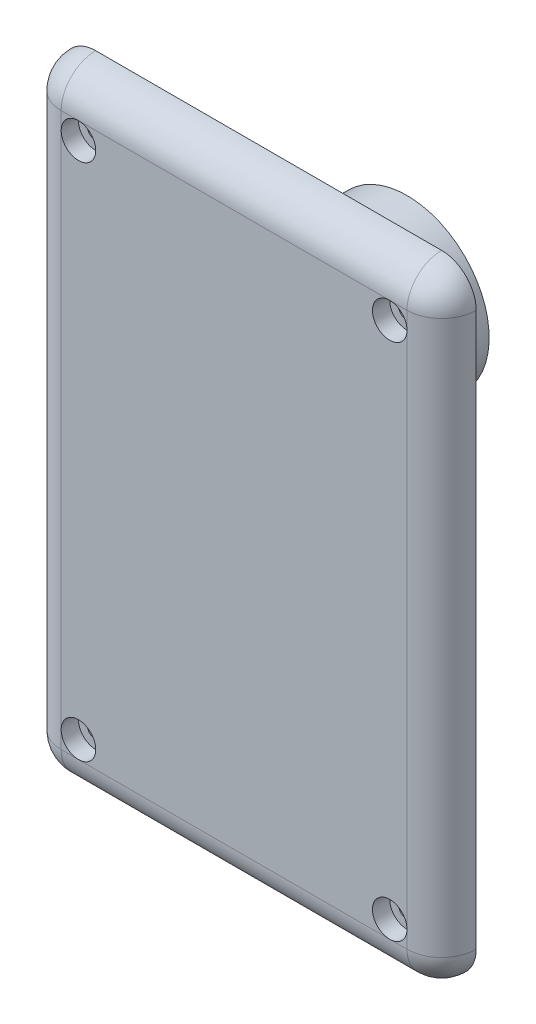
ISO-10303-21;
HEADER;
FILE_DESCRIPTION(('STEP AP214'),'2;1');
FILE_NAME('part.step','',(''),(''),'','','');
FILE_SCHEMA(('AUTOMOTIVE_DESIGN { 1 0 10303 214 1 1 1 1 }'));
ENDSEC;
DATA;
#1=APPLICATION_CONTEXT('core data for automotive mechanical design processes');
#2=APPLICATION_PROTOCOL_DEFINITION('international standard','automotive_design',2000,#1);
#3=PRODUCT_CONTEXT('',#1,'mechanical');
#4=PRODUCT('Part','Part','',(#3));
#5=PRODUCT_RELATED_PRODUCT_CATEGORY('part','',(#4));
#6=PRODUCT_DEFINITION_FORMATION('','',#4);
#7=PRODUCT_DEFINITION_CONTEXT('part definition',#1,'design');
#8=PRODUCT_DEFINITION('design','',#6,#7);
#9=PRODUCT_DEFINITION_SHAPE('','',#8);
#10=(LENGTH_UNIT() NAMED_UNIT(*) SI_UNIT(.MILLI.,.METRE.));
#11=(NAMED_UNIT(*) PLANE_ANGLE_UNIT() SI_UNIT($,.RADIAN.));
#12=(NAMED_UNIT(*) SI_UNIT($,.STERADIAN.) SOLID_ANGLE_UNIT());
#13=UNCERTAINTY_MEASURE_WITH_UNIT(LENGTH_MEASURE(1.E-05),#10,'distance_accuracy_value','');
#14=(GEOMETRIC_REPRESENTATION_CONTEXT(3) GLOBAL_UNCERTAINTY_ASSIGNED_CONTEXT((#13)) GLOBAL_UNIT_ASSIGNED_CONTEXT((#10,
#11,#12)) REPRESENTATION_CONTEXT('',''));
#15=CARTESIAN_POINT('',(0.,0.,0.));
#16=DIRECTION('',(0.,0.,1.));
#17=DIRECTION('',(1.,0.,0.));
#18=AXIS2_PLACEMENT_3D('',#15,#16,#17);
#19=CARTESIAN_POINT('',(0.,0.,0.));
#20=DIRECTION('',(0.,0.,-1.));
#21=DIRECTION('',(-1.,0.,0.));
#22=AXIS2_PLACEMENT_3D('',#19,#20,#21);
#23=PLANE('',#22);
#24=CARTESIAN_POINT('',(-118.790086771129,74.7285838497429,0.));
#25=DIRECTION('',(0.,0.,-1.));
#26=DIRECTION('',(-1.,0.,0.));
#27=AXIS2_PLACEMENT_3D('',#24,#25,#26);
#28=CIRCLE('',#27,0.499999999999999);
#29=CARTESIAN_POINT('',(-119.290086771129,74.7285838497429,0.));
#30=VERTEX_POINT('',#29);
#31=EDGE_CURVE('E186',#30,#30,#28,.F.);
#32=ORIENTED_EDGE('',*,*,#31,.T.);
#33=EDGE_LOOP('',(#32));
#34=FACE_BOUND('',#33,.T.);
#35=CARTESIAN_POINT('',(-100.790086771129,74.7285838497429,0.));
#36=DIRECTION('',(0.,0.,-1.));
#37=DIRECTION('',(-1.,0.,0.));
#38=AXIS2_PLACEMENT_3D('',#35,#36,#37);
#39=CIRCLE('',#38,0.499999999999999);
#40=CARTESIAN_POINT('',(-101.290086771129,74.7285838497429,0.));
#41=VERTEX_POINT('',#40);
#42=EDGE_CURVE('E218',#41,#41,#39,.F.);
#43=ORIENTED_EDGE('',*,*,#42,.T.);
#44=EDGE_LOOP('',(#43));
#45=FACE_BOUND('',#44,.T.);
#46=CARTESIAN_POINT('',(-100.790086771129,44.728583849743,0.));
#47=DIRECTION('',(0.,0.,-1.));
#48=DIRECTION('',(-1.,0.,0.));
#49=AXIS2_PLACEMENT_3D('',#46,#47,#48);
#50=CIRCLE('',#49,0.499999999999999);
#51=CARTESIAN_POINT('',(-101.290086771129,44.728583849743,0.));
#52=VERTEX_POINT('',#51);
#53=EDGE_CURVE('E210',#52,#52,#50,.F.);
#54=ORIENTED_EDGE('',*,*,#53,.T.);
#55=EDGE_LOOP('',(#54));
#56=FACE_BOUND('',#55,.T.);
#57=CARTESIAN_POINT('',(-118.790086771129,44.728583849743,0.));
#58=DIRECTION('',(0.,0.,-1.));
#59=DIRECTION('',(-1.,0.,0.));
#60=AXIS2_PLACEMENT_3D('',#57,#58,#59);
#61=CIRCLE('',#60,0.499999999999999);
#62=CARTESIAN_POINT('',(-119.290086771129,44.728583849743,0.));
#63=VERTEX_POINT('',#62);
#64=EDGE_CURVE('E209',#63,#63,#61,.F.);
#65=ORIENTED_EDGE('',*,*,#64,.T.);
#66=EDGE_LOOP('',(#65));
#67=FACE_BOUND('',#66,.T.);
#68=CARTESIAN_POINT('',(-117.420086771129,66.208583849743,0.));
#69=DIRECTION('',(0.,0.,-1.));
#70=DIRECTION('',(-1.,0.,0.));
#71=AXIS2_PLACEMENT_3D('',#68,#69,#70);
#72=CIRCLE('',#71,2.04999999999999);
#73=CARTESIAN_POINT('',(-119.470086771129,66.208583849743,0.));
#74=VERTEX_POINT('',#73);
#75=EDGE_CURVE('E302',#74,#74,#72,.T.);
#76=ORIENTED_EDGE('',*,*,#75,.F.);
#77=EDGE_LOOP('',(#76));
#78=FACE_BOUND('',#77,.T.);
#79=DIRECTION('',(0.,-1.,0.));
#80=VECTOR('',#79,1.);
#81=CARTESIAN_POINT('',(-121.790086771129,77.7285838497429,0.));
#82=LINE('',#81,#80);
#83=CARTESIAN_POINT('',(-121.790086771129,75.7285838497429,0.));
#84=VERTEX_POINT('',#83);
#85=CARTESIAN_POINT('',(-121.790086771129,43.728583849743,0.));
#86=VERTEX_POINT('',#85);
#87=EDGE_CURVE('E325',#84,#86,#82,.T.);
#88=ORIENTED_EDGE('',*,*,#87,.F.);
#89=CARTESIAN_POINT('',(-119.790086771129,75.7285838497429,0.));
#90=DIRECTION('',(0.,0.,-1.));
#91=DIRECTION('',(-1.,0.,0.));
#92=AXIS2_PLACEMENT_3D('',#89,#90,#91);
#93=CIRCLE('',#92,2.);
#94=CARTESIAN_POINT('',(-119.790086771129,77.7285838497429,0.));
#95=VERTEX_POINT('',#94);
#96=EDGE_CURVE('E342',#84,#95,#93,.T.);
#97=ORIENTED_EDGE('',*,*,#96,.T.);
#98=DIRECTION('',(-1.,0.,0.));
#99=VECTOR('',#98,1.);
#100=CARTESIAN_POINT('',(-97.7900867711287,77.7285838497429,0.));
#101=LINE('',#100,#99);
#102=CARTESIAN_POINT('',(-99.7900867711287,77.7285838497429,0.));
#103=VERTEX_POINT('',#102);
#104=EDGE_CURVE('E320',#103,#95,#101,.T.);
#105=ORIENTED_EDGE('',*,*,#104,.F.);
#106=CARTESIAN_POINT('',(-99.7900867711287,75.7285838497429,0.));
#107=DIRECTION('',(0.,0.,-1.));
#108=DIRECTION('',(-1.,0.,0.));
#109=AXIS2_PLACEMENT_3D('',#106,#107,#108);
#110=CIRCLE('',#109,2.);
#111=CARTESIAN_POINT('',(-97.7900867711287,75.7285838497429,0.));
#112=VERTEX_POINT('',#111);
#113=EDGE_CURVE('E333',#103,#112,#110,.T.);
#114=ORIENTED_EDGE('',*,*,#113,.T.);
#115=DIRECTION('',(0.,1.,0.));
#116=VECTOR('',#115,1.);
#117=CARTESIAN_POINT('',(-97.7900867711287,77.7285838497429,0.));
#118=LINE('',#117,#116);
#119=CARTESIAN_POINT('',(-97.7900867711287,43.728583849743,0.));
#120=VERTEX_POINT('',#119);
#121=EDGE_CURVE('E316',#120,#112,#118,.T.);
#122=ORIENTED_EDGE('',*,*,#121,.F.);
#123=CARTESIAN_POINT('',(-99.7900867711287,43.728583849743,0.));
#124=DIRECTION('',(0.,0.,-1.));
#125=DIRECTION('',(-1.,0.,0.));
#126=AXIS2_PLACEMENT_3D('',#123,#124,#125);
#127=CIRCLE('',#126,2.);
#128=CARTESIAN_POINT('',(-99.7900867711287,41.7285838497429,0.));
#129=VERTEX_POINT('',#128);
#130=EDGE_CURVE('E336',#120,#129,#127,.T.);
#131=ORIENTED_EDGE('',*,*,#130,.T.);
#132=DIRECTION('',(1.,0.,0.));
#133=VECTOR('',#132,1.);
#134=CARTESIAN_POINT('',(-97.7900867711287,41.7285838497429,0.));
#135=LINE('',#134,#133);
#136=CARTESIAN_POINT('',(-119.790086771129,41.7285838497429,0.));
#137=VERTEX_POINT('',#136);
#138=EDGE_CURVE('E329',#137,#129,#135,.T.);
#139=ORIENTED_EDGE('',*,*,#138,.F.);
#140=CARTESIAN_POINT('',(-119.790086771129,43.728583849743,0.));
#141=DIRECTION('',(0.,0.,-1.));
#142=DIRECTION('',(-1.,0.,0.));
#143=AXIS2_PLACEMENT_3D('',#140,#141,#142);
#144=CIRCLE('',#143,2.);
#145=EDGE_CURVE('E339',#137,#86,#144,.T.);
#146=ORIENTED_EDGE('',*,*,#145,.T.);
#147=EDGE_LOOP('',(#88,#97,#105,#114,#122,#131,#139,#146));
#148=FACE_BOUND('',#147,.T.);
#149=CARTESIAN_POINT('',(-111.064703450319,59.5461546390721,0.));
#150=DIRECTION('',(0.,0.,-1.));
#151=DIRECTION('',(-1.,0.,0.));
#152=AXIS2_PLACEMENT_3D('',#149,#150,#151);
#153=CIRCLE('',#152,0.446350937115385);
#154=CARTESIAN_POINT('',(-110.66017212026,59.357518581902,0.));
#155=VERTEX_POINT('',#154);
#156=CARTESIAN_POINT('',(-111.469234780377,59.7347906962421,0.));
#157=VERTEX_POINT('',#156);
#158=EDGE_CURVE('E197',#155,#157,#153,.T.);
#159=ORIENTED_EDGE('',*,*,#158,.F.);
#160=DIRECTION('',(-0.422618261740702,-0.906307787036649,0.));
#161=VECTOR('',#160,1.);
#162=CARTESIAN_POINT('',(-107.336861805428,66.4843805510597,0.));
#163=LINE('',#162,#161);
#164=CARTESIAN_POINT('',(-107.435569346074,66.2727015470387,0.));
#165=VERTEX_POINT('',#164);
#166=EDGE_CURVE('E181',#165,#155,#163,.T.);
#167=ORIENTED_EDGE('',*,*,#166,.F.);
#168=CARTESIAN_POINT('',(-105.790086771129,70.7285838497429,0.));
#169=DIRECTION('',(0.,0.,-1.));
#170=DIRECTION('',(-1.,0.,0.));
#171=AXIS2_PLACEMENT_3D('',#168,#169,#170);
#172=CIRCLE('',#171,4.75000000000001);
#173=CARTESIAN_POINT('',(-107.295042198371,66.2232970484379,0.));
#174=VERTEX_POINT('',#173);
#175=EDGE_CURVE('E304',#174,#165,#172,.T.);
#176=ORIENTED_EDGE('',*,*,#175,.F.);
#177=DIRECTION('',(0.,-1.,0.));
#178=VECTOR('',#177,1.);
#179=CARTESIAN_POINT('',(-107.295042198371,64.8064399228721,0.));
#180=LINE('',#179,#178);
#181=CARTESIAN_POINT('',(-107.295042198371,67.0224930302927,0.));
#182=VERTEX_POINT('',#181);
#183=EDGE_CURVE('E271',#182,#174,#180,.T.);
#184=ORIENTED_EDGE('',*,*,#183,.F.);
#185=CARTESIAN_POINT('',(-105.790086771129,70.7285838497429,0.));
#186=DIRECTION('',(0.,0.,-1.));
#187=DIRECTION('',(-1.,0.,0.));
#188=AXIS2_PLACEMENT_3D('',#185,#186,#187);
#189=CIRCLE('',#188,4.00000000000001);
#190=CARTESIAN_POINT('',(-104.296751001088,67.0177957558312,0.));
#191=VERTEX_POINT('',#190);
#192=EDGE_CURVE('E369',#191,#182,#189,.F.);
#193=ORIENTED_EDGE('',*,*,#192,.F.);
#194=DIRECTION('',(0.,1.,0.));
#195=VECTOR('',#194,1.);
#196=CARTESIAN_POINT('',(-104.296751001088,64.7051981513873,0.));
#197=LINE('',#196,#195);
#198=CARTESIAN_POINT('',(-104.296751001088,66.2194322357565,0.));
#199=VERTEX_POINT('',#198);
#200=EDGE_CURVE('E268',#199,#191,#197,.T.);
#201=ORIENTED_EDGE('',*,*,#200,.F.);
#202=CARTESIAN_POINT('',(-108.240281590429,66.6593031580881,0.));
#203=VERTEX_POINT('',#202);
#204=EDGE_CURVE('E299',#203,#199,#172,.T.);
#205=ORIENTED_EDGE('',*,*,#204,.F.);
#206=DIRECTION('',(-0.422618261740703,-0.906307787036648,0.));
#207=VECTOR('',#206,1.);
#208=CARTESIAN_POINT('',(-108.145924465545,66.8616526653998,0.));
#209=LINE('',#208,#207);
#210=EDGE_CURVE('E175',#203,#157,#209,.T.);
#211=ORIENTED_EDGE('',*,*,#210,.T.);
#212=EDGE_LOOP('',(#159,#167,#176,#184,#193,#201,#205,#211));
#213=FACE_BOUND('',#212,.T.);
#214=ADVANCED_FACE('F39',(#34,#45,#56,#67,#78,#148,#213),#23,.T.);
#215=CARTESIAN_POINT('',(-105.790086771129,70.7285838497429,-4.));
#216=DIRECTION('',(0.,0.,1.));
#217=DIRECTION('',(1.,0.,0.));
#218=AXIS2_PLACEMENT_3D('',#215,#216,#217);
#219=CYLINDRICAL_SURFACE('',#218,4.75000000000001);
#220=DIRECTION('',(0.,0.,1.));
#221=VECTOR('',#220,1.);
#222=CARTESIAN_POINT('',(-107.435569346074,66.2727015470387,-4.));
#223=LINE('',#222,#221);
#224=CARTESIAN_POINT('',(-107.435569346074,66.2727015470387,-4.));
#225=VERTEX_POINT('',#224);
#226=EDGE_CURVE('E11',#225,#165,#223,.T.);
#227=ORIENTED_EDGE('',*,*,#226,.F.);
#228=CARTESIAN_POINT('',(-105.790086771129,70.7285838497429,-4.));
#229=DIRECTION('',(0.,0.,-1.));
#230=DIRECTION('',(-1.,0.,0.));
#231=AXIS2_PLACEMENT_3D('',#228,#229,#230);
#232=CIRCLE('',#231,4.75000000000001);
#233=CARTESIAN_POINT('',(-107.295042198371,66.2232970484379,-4.));
#234=VERTEX_POINT('',#233);
#235=EDGE_CURVE('E171',#234,#225,#232,.T.);
#236=ORIENTED_EDGE('',*,*,#235,.F.);
#237=DIRECTION('',(0.,0.,1.));
#238=VECTOR('',#237,1.);
#239=CARTESIAN_POINT('',(-107.295042198371,66.2232970484379,-4.));
#240=LINE('',#239,#238);
#241=EDGE_CURVE('E291',#234,#174,#240,.T.);
#242=ORIENTED_EDGE('',*,*,#241,.T.);
#243=ORIENTED_EDGE('',*,*,#175,.T.);
#244=EDGE_LOOP('',(#227,#236,#242,#243));
#245=FACE_BOUND('',#244,.T.);
#246=ADVANCED_FACE('F453',(#245),#219,.T.);
#247=CARTESIAN_POINT('',(0.,0.,2.));
#248=DIRECTION('',(0.,0.,-1.));
#249=DIRECTION('',(-1.,0.,0.));
#250=AXIS2_PLACEMENT_3D('',#247,#248,#249);
#251=PLANE('',#250);
#252=DIRECTION('',(0.,-1.,0.));
#253=VECTOR('',#252,1.);
#254=CARTESIAN_POINT('',(-119.790086771129,0.,2.));
#255=LINE('',#254,#253);
#256=CARTESIAN_POINT('',(-119.790086771129,75.7285838497429,2.));
#257=VERTEX_POINT('',#256);
#258=CARTESIAN_POINT('',(-119.790086771129,74.7285838497429,2.));
#259=VERTEX_POINT('',#258);
#260=EDGE_CURVE('E365',#257,#259,#255,.T.);
#261=ORIENTED_EDGE('',*,*,#260,.T.);
#262=CARTESIAN_POINT('',(-118.790086771129,74.7285838497429,2.));
#263=DIRECTION('',(0.,0.,1.));
#264=DIRECTION('',(1.,0.,0.));
#265=AXIS2_PLACEMENT_3D('',#262,#263,#264);
#266=CIRCLE('',#265,0.999999999999998);
#267=CARTESIAN_POINT('',(-118.790086771129,75.7285838497429,2.));
#268=VERTEX_POINT('',#267);
#269=EDGE_CURVE('E257',#268,#259,#266,.T.);
#270=ORIENTED_EDGE('',*,*,#269,.F.);
#271=DIRECTION('',(-1.,0.,0.));
#272=VECTOR('',#271,1.);
#273=CARTESIAN_POINT('',(0.,75.7285838497429,2.));
#274=LINE('',#273,#272);
#275=EDGE_CURVE('E346',#268,#257,#274,.T.);
#276=ORIENTED_EDGE('',*,*,#275,.T.);
#277=EDGE_LOOP('',(#261,#270,#276));
#278=FACE_BOUND('',#277,.T.);
#279=ADVANCED_FACE('F429',(#278),#251,.F.);
#280=CARTESIAN_POINT('',(-100.790086771129,75.7285838497429,2.));
#281=VERTEX_POINT('',#280);
#282=EDGE_CURVE('E352',#281,#268,#274,.T.);
#283=ORIENTED_EDGE('',*,*,#282,.T.);
#284=EDGE_CURVE('E233',#259,#268,#266,.T.);
#285=ORIENTED_EDGE('',*,*,#284,.F.);
#286=CARTESIAN_POINT('',(-119.790086771129,44.728583849743,2.));
#287=VERTEX_POINT('',#286);
#288=EDGE_CURVE('E370',#259,#287,#255,.T.);
#289=ORIENTED_EDGE('',*,*,#288,.T.);
#290=CARTESIAN_POINT('',(-118.790086771129,44.728583849743,2.));
#291=DIRECTION('',(0.,0.,1.));
#292=DIRECTION('',(1.,0.,0.));
#293=AXIS2_PLACEMENT_3D('',#290,#291,#292);
#294=CIRCLE('',#293,0.999999999999998);
#295=CARTESIAN_POINT('',(-118.790086771129,43.728583849743,2.));
#296=VERTEX_POINT('',#295);
#297=EDGE_CURVE('E252',#296,#287,#294,.T.);
#298=ORIENTED_EDGE('',*,*,#297,.F.);
#299=DIRECTION('',(1.,0.,0.));
#300=VECTOR('',#299,1.);
#301=CARTESIAN_POINT('',(0.,43.728583849743,2.));
#302=LINE('',#301,#300);
#303=CARTESIAN_POINT('',(-100.790086771129,43.728583849743,2.));
#304=VERTEX_POINT('',#303);
#305=EDGE_CURVE('E364',#296,#304,#302,.T.);
#306=ORIENTED_EDGE('',*,*,#305,.T.);
#307=CARTESIAN_POINT('',(-100.790086771129,44.728583849743,2.));
#308=DIRECTION('',(0.,0.,1.));
#309=DIRECTION('',(1.,0.,0.));
#310=AXIS2_PLACEMENT_3D('',#307,#308,#309);
#311=CIRCLE('',#310,0.999999999999998);
#312=CARTESIAN_POINT('',(-99.7900867711287,44.728583849743,2.));
#313=VERTEX_POINT('',#312);
#314=EDGE_CURVE('E242',#313,#304,#311,.T.);
#315=ORIENTED_EDGE('',*,*,#314,.F.);
#316=DIRECTION('',(0.,1.,0.));
#317=VECTOR('',#316,1.);
#318=CARTESIAN_POINT('',(-99.7900867711287,0.,2.));
#319=LINE('',#318,#317);
#320=CARTESIAN_POINT('',(-99.7900867711287,74.7285838497429,2.));
#321=VERTEX_POINT('',#320);
#322=EDGE_CURVE('E358',#313,#321,#319,.T.);
#323=ORIENTED_EDGE('',*,*,#322,.T.);
#324=CARTESIAN_POINT('',(-100.790086771129,74.7285838497429,2.));
#325=DIRECTION('',(0.,0.,1.));
#326=DIRECTION('',(1.,0.,0.));
#327=AXIS2_PLACEMENT_3D('',#324,#325,#326);
#328=CIRCLE('',#327,0.999999999999998);
#329=EDGE_CURVE('E241',#281,#321,#328,.T.);
#330=ORIENTED_EDGE('',*,*,#329,.F.);
#331=EDGE_LOOP('',(#283,#285,#289,#298,#306,#315,#323,#330));
#332=FACE_BOUND('',#331,.T.);
#333=ADVANCED_FACE('F438',(#332),#251,.F.);
#334=CARTESIAN_POINT('',(-99.7900867711287,43.728583849743,2.));
#335=VERTEX_POINT('',#334);
#336=EDGE_CURVE('E353',#335,#313,#319,.T.);
#337=ORIENTED_EDGE('',*,*,#336,.T.);
#338=EDGE_CURVE('E62',#304,#313,#311,.T.);
#339=ORIENTED_EDGE('',*,*,#338,.F.);
#340=EDGE_CURVE('E357',#304,#335,#302,.T.);
#341=ORIENTED_EDGE('',*,*,#340,.T.);
#342=EDGE_LOOP('',(#337,#339,#341));
#343=FACE_BOUND('',#342,.T.);
#344=ADVANCED_FACE('F650',(#343),#251,.F.);
#345=CARTESIAN_POINT('',(-99.7900867711287,75.7285838497429,2.));
#346=VERTEX_POINT('',#345);
#347=EDGE_CURVE('E347',#346,#281,#274,.T.);
#348=ORIENTED_EDGE('',*,*,#347,.T.);
#349=EDGE_CURVE('E265',#321,#281,#328,.T.);
#350=ORIENTED_EDGE('',*,*,#349,.F.);
#351=EDGE_CURVE('E351',#321,#346,#319,.T.);
#352=ORIENTED_EDGE('',*,*,#351,.T.);
#353=EDGE_LOOP('',(#348,#350,#352));
#354=FACE_BOUND('',#353,.T.);
#355=ADVANCED_FACE('F657',(#354),#251,.F.);
#356=CARTESIAN_POINT('',(-119.790086771129,43.728583849743,2.));
#357=VERTEX_POINT('',#356);
#358=EDGE_CURVE('E359',#357,#296,#302,.T.);
#359=ORIENTED_EDGE('',*,*,#358,.T.);
#360=EDGE_CURVE('E249',#287,#296,#294,.T.);
#361=ORIENTED_EDGE('',*,*,#360,.F.);
#362=EDGE_CURVE('E363',#287,#357,#255,.T.);
#363=ORIENTED_EDGE('',*,*,#362,.T.);
#364=EDGE_LOOP('',(#359,#361,#363));
#365=FACE_BOUND('',#364,.T.);
#366=ADVANCED_FACE('F461',(#365),#251,.F.);
#367=CARTESIAN_POINT('',(-99.7900867711287,43.728583849743,0.));
#368=DIRECTION('',(1.,0.,0.));
#369=DIRECTION('',(0.,0.,-1.));
#370=AXIS2_PLACEMENT_3D('',#367,#368,#369);
#371=SPHERICAL_SURFACE('',#370,2.);
#372=CARTESIAN_POINT('',(-99.7900867711287,43.728583849743,0.));
#373=DIRECTION('',(1.,0.,0.));
#374=DIRECTION('',(0.,0.,-1.));
#375=AXIS2_PLACEMENT_3D('',#372,#373,#374);
#376=CIRCLE('',#375,2.);
#377=EDGE_CURVE('E393',#129,#335,#376,.F.);
#378=ORIENTED_EDGE('',*,*,#377,.F.);
#379=ORIENTED_EDGE('',*,*,#130,.F.);
#380=CARTESIAN_POINT('',(-99.7900867711287,43.728583849743,0.));
#381=DIRECTION('',(0.,-1.,0.));
#382=DIRECTION('',(0.,0.,-1.));
#383=AXIS2_PLACEMENT_3D('',#380,#381,#382);
#384=CIRCLE('',#383,2.);
#385=EDGE_CURVE('E321',#335,#120,#384,.F.);
#386=ORIENTED_EDGE('',*,*,#385,.F.);
#387=EDGE_LOOP('',(#378,#379,#386));
#388=FACE_BOUND('',#387,.T.);
#389=ADVANCED_FACE('F41',(#388),#371,.T.);
#390=CARTESIAN_POINT('',(-99.7900867711287,0.,0.));
#391=DIRECTION('',(0.,1.,0.));
#392=DIRECTION('',(-1.,0.,0.));
#393=AXIS2_PLACEMENT_3D('',#390,#391,#392);
#394=CYLINDRICAL_SURFACE('',#393,2.);
#395=ORIENTED_EDGE('',*,*,#385,.T.);
#396=ORIENTED_EDGE('',*,*,#121,.T.);
#397=CARTESIAN_POINT('',(-99.7900867711287,75.7285838497429,0.));
#398=DIRECTION('',(0.,1.,0.));
#399=DIRECTION('',(0.,0.,1.));
#400=AXIS2_PLACEMENT_3D('',#397,#398,#399);
#401=CIRCLE('',#400,2.);
#402=EDGE_CURVE('E389',#346,#112,#401,.T.);
#403=ORIENTED_EDGE('',*,*,#402,.F.);
#404=ORIENTED_EDGE('',*,*,#351,.F.);
#405=ORIENTED_EDGE('',*,*,#322,.F.);
#406=ORIENTED_EDGE('',*,*,#336,.F.);
#407=EDGE_LOOP('',(#395,#396,#403,#404,#405,#406));
#408=FACE_BOUND('',#407,.T.);
#409=ADVANCED_FACE('F740',(#408),#394,.T.);
#410=CARTESIAN_POINT('',(0.,43.728583849743,0.));
#411=DIRECTION('',(1.,0.,0.));
#412=DIRECTION('',(0.,0.,-1.));
#413=AXIS2_PLACEMENT_3D('',#410,#411,#412);
#414=CYLINDRICAL_SURFACE('',#413,2.);
#415=ORIENTED_EDGE('',*,*,#377,.T.);
#416=ORIENTED_EDGE('',*,*,#340,.F.);
#417=ORIENTED_EDGE('',*,*,#305,.F.);
#418=ORIENTED_EDGE('',*,*,#358,.F.);
#419=CARTESIAN_POINT('',(-119.790086771129,43.728583849743,0.));
#420=DIRECTION('',(-1.,0.,0.));
#421=DIRECTION('',(0.,0.,1.));
#422=AXIS2_PLACEMENT_3D('',#419,#420,#421);
#423=CIRCLE('',#422,2.);
#424=EDGE_CURVE('E385',#137,#357,#423,.T.);
#425=ORIENTED_EDGE('',*,*,#424,.F.);
#426=ORIENTED_EDGE('',*,*,#138,.T.);
#427=EDGE_LOOP('',(#415,#416,#417,#418,#425,#426));
#428=FACE_BOUND('',#427,.T.);
#429=ADVANCED_FACE('F729',(#428),#414,.T.);
#430=CARTESIAN_POINT('',(-99.7900867711287,75.7285838497429,0.));
#431=DIRECTION('',(1.,0.,0.));
#432=DIRECTION('',(0.,0.,-1.));
#433=AXIS2_PLACEMENT_3D('',#430,#431,#432);
#434=SPHERICAL_SURFACE('',#433,2.);
#435=ORIENTED_EDGE('',*,*,#402,.T.);
#436=ORIENTED_EDGE('',*,*,#113,.F.);
#437=CARTESIAN_POINT('',(-99.7900867711287,75.7285838497429,0.));
#438=DIRECTION('',(1.,0.,0.));
#439=DIRECTION('',(0.,0.,-1.));
#440=AXIS2_PLACEMENT_3D('',#437,#438,#439);
#441=CIRCLE('',#440,2.);
#442=EDGE_CURVE('E381',#346,#103,#441,.F.);
#443=ORIENTED_EDGE('',*,*,#442,.F.);
#444=EDGE_LOOP('',(#435,#436,#443));
#445=FACE_BOUND('',#444,.T.);
#446=ADVANCED_FACE('F717',(#445),#434,.T.);
#447=CARTESIAN_POINT('',(-119.790086771129,43.728583849743,0.));
#448=DIRECTION('',(0.,-1.,0.));
#449=DIRECTION('',(0.,0.,-1.));
#450=AXIS2_PLACEMENT_3D('',#447,#448,#449);
#451=SPHERICAL_SURFACE('',#450,2.);
#452=ORIENTED_EDGE('',*,*,#145,.F.);
#453=ORIENTED_EDGE('',*,*,#424,.T.);
#454=CARTESIAN_POINT('',(-119.790086771129,43.728583849743,0.));
#455=DIRECTION('',(0.,-1.,0.));
#456=DIRECTION('',(0.,0.,-1.));
#457=AXIS2_PLACEMENT_3D('',#454,#455,#456);
#458=CIRCLE('',#457,2.);
#459=EDGE_CURVE('E377',#86,#357,#458,.F.);
#460=ORIENTED_EDGE('',*,*,#459,.F.);
#461=EDGE_LOOP('',(#452,#453,#460));
#462=FACE_BOUND('',#461,.T.);
#463=ADVANCED_FACE('F712',(#462),#451,.T.);
#464=CARTESIAN_POINT('',(0.,75.7285838497429,0.));
#465=DIRECTION('',(-1.,0.,0.));
#466=DIRECTION('',(0.,0.,1.));
#467=AXIS2_PLACEMENT_3D('',#464,#465,#466);
#468=CYLINDRICAL_SURFACE('',#467,2.);
#469=ORIENTED_EDGE('',*,*,#442,.T.);
#470=ORIENTED_EDGE('',*,*,#104,.T.);
#471=CARTESIAN_POINT('',(-119.790086771129,75.7285838497429,0.));
#472=DIRECTION('',(-1.,0.,0.));
#473=DIRECTION('',(0.,0.,1.));
#474=AXIS2_PLACEMENT_3D('',#471,#472,#473);
#475=CIRCLE('',#474,2.);
#476=EDGE_CURVE('E374',#257,#95,#475,.T.);
#477=ORIENTED_EDGE('',*,*,#476,.F.);
#478=ORIENTED_EDGE('',*,*,#275,.F.);
#479=ORIENTED_EDGE('',*,*,#282,.F.);
#480=ORIENTED_EDGE('',*,*,#347,.F.);
#481=EDGE_LOOP('',(#469,#470,#477,#478,#479,#480));
#482=FACE_BOUND('',#481,.T.);
#483=ADVANCED_FACE('F434',(#482),#468,.T.);
#484=CARTESIAN_POINT('',(-119.790086771129,0.,0.));
#485=DIRECTION('',(0.,-1.,0.));
#486=DIRECTION('',(0.,0.,-1.));
#487=AXIS2_PLACEMENT_3D('',#484,#485,#486);
#488=CYLINDRICAL_SURFACE('',#487,2.);
#489=ORIENTED_EDGE('',*,*,#459,.T.);
#490=ORIENTED_EDGE('',*,*,#362,.F.);
#491=ORIENTED_EDGE('',*,*,#288,.F.);
#492=ORIENTED_EDGE('',*,*,#260,.F.);
#493=CARTESIAN_POINT('',(-119.790086771129,75.7285838497429,0.));
#494=DIRECTION('',(0.,1.,0.));
#495=DIRECTION('',(0.,0.,1.));
#496=AXIS2_PLACEMENT_3D('',#493,#494,#495);
#497=CIRCLE('',#496,2.);
#498=EDGE_CURVE('E312',#84,#257,#497,.T.);
#499=ORIENTED_EDGE('',*,*,#498,.F.);
#500=ORIENTED_EDGE('',*,*,#87,.T.);
#501=EDGE_LOOP('',(#489,#490,#491,#492,#499,#500));
#502=FACE_BOUND('',#501,.T.);
#503=ADVANCED_FACE('F704',(#502),#488,.T.);
#504=CARTESIAN_POINT('',(-119.790086771129,75.7285838497429,0.));
#505=DIRECTION('',(0.,0.,1.));
#506=DIRECTION('',(1.,0.,0.));
#507=AXIS2_PLACEMENT_3D('',#504,#505,#506);
#508=SPHERICAL_SURFACE('',#507,2.);
#509=ORIENTED_EDGE('',*,*,#96,.F.);
#510=ORIENTED_EDGE('',*,*,#498,.T.);
#511=ORIENTED_EDGE('',*,*,#476,.T.);
#512=EDGE_LOOP('',(#509,#510,#511));
#513=FACE_BOUND('',#512,.T.);
#514=ADVANCED_FACE('F694',(#513),#508,.T.);
#515=CARTESIAN_POINT('',(-117.420086771129,66.208583849743,1.));
#516=DIRECTION('',(0.,0.,-1.));
#517=DIRECTION('',(-1.,0.,0.));
#518=AXIS2_PLACEMENT_3D('',#515,#516,#517);
#519=CYLINDRICAL_SURFACE('',#518,2.04999999999999);
#520=CARTESIAN_POINT('',(-117.420086771129,66.208583849743,1.));
#521=DIRECTION('',(0.,0.,-1.));
#522=DIRECTION('',(-1.,0.,0.));
#523=AXIS2_PLACEMENT_3D('',#520,#521,#522);
#524=CIRCLE('',#523,2.04999999999999);
#525=CARTESIAN_POINT('',(-119.470086771129,66.208583849743,1.));
#526=VERTEX_POINT('',#525);
#527=EDGE_CURVE('E308',#526,#526,#524,.T.);
#528=ORIENTED_EDGE('',*,*,#527,.F.);
#529=EDGE_LOOP('',(#528));
#530=FACE_BOUND('',#529,.T.);
#531=ORIENTED_EDGE('',*,*,#75,.T.);
#532=EDGE_LOOP('',(#531));
#533=FACE_BOUND('',#532,.T.);
#534=ADVANCED_FACE('F476',(#530,#533),#519,.F.);
#535=CARTESIAN_POINT('',(-117.420086771129,66.208583849743,1.));
#536=DIRECTION('',(0.,0.,-1.));
#537=DIRECTION('',(-1.,0.,0.));
#538=AXIS2_PLACEMENT_3D('',#535,#536,#537);
#539=PLANE('',#538);
#540=ORIENTED_EDGE('',*,*,#527,.T.);
#541=EDGE_LOOP('',(#540));
#542=FACE_BOUND('',#541,.T.);
#543=ADVANCED_FACE('F472',(#542),#539,.T.);
#544=CARTESIAN_POINT('',(-105.790086771129,70.7285838497429,-4.));
#545=DIRECTION('',(0.,0.,-1.));
#546=DIRECTION('',(-1.,0.,0.));
#547=AXIS2_PLACEMENT_3D('',#544,#545,#546);
#548=PLANE('',#547);
#549=CARTESIAN_POINT('',(-105.790086771129,70.7285838497429,-4.));
#550=DIRECTION('',(0.,0.,-1.));
#551=DIRECTION('',(-1.,0.,0.));
#552=AXIS2_PLACEMENT_3D('',#549,#550,#551);
#553=CIRCLE('',#552,4.00000000000001);
#554=CARTESIAN_POINT('',(-107.295042198371,67.0224930302927,-4.));
#555=VERTEX_POINT('',#554);
#556=CARTESIAN_POINT('',(-104.296751001088,67.0177957558312,-4.));
#557=VERTEX_POINT('',#556);
#558=EDGE_CURVE('E295',#555,#557,#553,.T.);
#559=ORIENTED_EDGE('',*,*,#558,.F.);
#560=DIRECTION('',(0.,1.,0.));
#561=VECTOR('',#560,1.);
#562=CARTESIAN_POINT('',(-107.295042198371,64.8064399228721,-4.));
#563=LINE('',#562,#561);
#564=EDGE_CURVE('E264',#234,#555,#563,.T.);
#565=ORIENTED_EDGE('',*,*,#564,.F.);
#566=ORIENTED_EDGE('',*,*,#235,.T.);
#567=DIRECTION('',(-0.422618261740702,-0.906307787036649,0.));
#568=VECTOR('',#567,1.);
#569=CARTESIAN_POINT('',(-107.336861805428,66.4843805510597,-4.));
#570=LINE('',#569,#568);
#571=CARTESIAN_POINT('',(-110.66017212026,59.357518581902,-4.));
#572=VERTEX_POINT('',#571);
#573=EDGE_CURVE('E162',#225,#572,#570,.T.);
#574=ORIENTED_EDGE('',*,*,#573,.T.);
#575=CARTESIAN_POINT('',(-111.064703450319,59.5461546390721,-4.));
#576=DIRECTION('',(0.,0.,-1.));
#577=DIRECTION('',(-1.,0.,0.));
#578=AXIS2_PLACEMENT_3D('',#575,#576,#577);
#579=CIRCLE('',#578,0.446350937115385);
#580=CARTESIAN_POINT('',(-111.469234780377,59.7347906962421,-4.));
#581=VERTEX_POINT('',#580);
#582=EDGE_CURVE('E167',#572,#581,#579,.T.);
#583=ORIENTED_EDGE('',*,*,#582,.T.);
#584=DIRECTION('',(-0.422618261740703,-0.906307787036648,0.));
#585=VECTOR('',#584,1.);
#586=CARTESIAN_POINT('',(-108.145924465545,66.8616526653998,-4.));
#587=LINE('',#586,#585);
#588=CARTESIAN_POINT('',(-108.240281590429,66.6593031580881,-4.));
#589=VERTEX_POINT('',#588);
#590=EDGE_CURVE('E55',#589,#581,#587,.T.);
#591=ORIENTED_EDGE('',*,*,#590,.F.);
#592=CARTESIAN_POINT('',(-104.296751001088,66.2194322357565,-4.));
#593=VERTEX_POINT('',#592);
#594=EDGE_CURVE('E303',#589,#593,#232,.T.);
#595=ORIENTED_EDGE('',*,*,#594,.T.);
#596=DIRECTION('',(0.,-1.,0.));
#597=VECTOR('',#596,1.);
#598=CARTESIAN_POINT('',(-104.296751001088,64.7051981513873,-4.));
#599=LINE('',#598,#597);
#600=EDGE_CURVE('E272',#557,#593,#599,.T.);
#601=ORIENTED_EDGE('',*,*,#600,.F.);
#602=EDGE_LOOP('',(#559,#565,#566,#574,#583,#591,#595,#601));
#603=FACE_BOUND('',#602,.T.);
#604=ADVANCED_FACE('F165',(#603),#548,.T.);
#605=ORIENTED_EDGE('',*,*,#594,.F.);
#606=DIRECTION('',(0.,0.,1.));
#607=VECTOR('',#606,1.);
#608=CARTESIAN_POINT('',(-108.240281590429,66.6593031580881,-4.));
#609=LINE('',#608,#607);
#610=EDGE_CURVE('E48',#589,#203,#609,.T.);
#611=ORIENTED_EDGE('',*,*,#610,.T.);
#612=ORIENTED_EDGE('',*,*,#204,.T.);
#613=DIRECTION('',(0.,0.,1.));
#614=VECTOR('',#613,1.);
#615=CARTESIAN_POINT('',(-104.296751001088,66.2194322357565,-4.));
#616=LINE('',#615,#614);
#617=EDGE_CURVE('E283',#199,#593,#616,.F.);
#618=ORIENTED_EDGE('',*,*,#617,.T.);
#619=EDGE_LOOP('',(#605,#611,#612,#618));
#620=FACE_BOUND('',#619,.T.);
#621=ADVANCED_FACE('F407',(#620),#219,.T.);
#622=CARTESIAN_POINT('',(-105.790086771129,70.7285838497429,-4.));
#623=DIRECTION('',(0.,0.,1.));
#624=DIRECTION('',(1.,0.,0.));
#625=AXIS2_PLACEMENT_3D('',#622,#623,#624);
#626=CYLINDRICAL_SURFACE('',#625,4.00000000000001);
#627=DIRECTION('',(0.,0.,1.));
#628=VECTOR('',#627,1.);
#629=CARTESIAN_POINT('',(-107.295042198371,67.0224930302927,-4.));
#630=LINE('',#629,#628);
#631=EDGE_CURVE('E287',#555,#182,#630,.T.);
#632=ORIENTED_EDGE('',*,*,#631,.F.);
#633=ORIENTED_EDGE('',*,*,#558,.T.);
#634=DIRECTION('',(0.,0.,1.));
#635=VECTOR('',#634,1.);
#636=CARTESIAN_POINT('',(-104.296751001088,67.0177957558312,-4.));
#637=LINE('',#636,#635);
#638=EDGE_CURVE('E275',#191,#557,#637,.F.);
#639=ORIENTED_EDGE('',*,*,#638,.F.);
#640=ORIENTED_EDGE('',*,*,#192,.T.);
#641=EDGE_LOOP('',(#632,#633,#639,#640));
#642=FACE_BOUND('',#641,.T.);
#643=ADVANCED_FACE('F448',(#642),#626,.F.);
#644=CARTESIAN_POINT('',(-107.295042198371,64.8064399228721,4.24143255324268));
#645=DIRECTION('',(-1.,0.,0.));
#646=DIRECTION('',(0.,0.,1.));
#647=AXIS2_PLACEMENT_3D('',#644,#645,#646);
#648=PLANE('',#647);
#649=ORIENTED_EDGE('',*,*,#183,.T.);
#650=ORIENTED_EDGE('',*,*,#241,.F.);
#651=ORIENTED_EDGE('',*,*,#564,.T.);
#652=ORIENTED_EDGE('',*,*,#631,.T.);
#653=EDGE_LOOP('',(#649,#650,#651,#652));
#654=FACE_BOUND('',#653,.T.);
#655=ADVANCED_FACE('F451',(#654),#648,.F.);
#656=CARTESIAN_POINT('',(-104.296751001088,64.7051981513873,4.24143255324268));
#657=DIRECTION('',(1.,0.,0.));
#658=DIRECTION('',(0.,0.,-1.));
#659=AXIS2_PLACEMENT_3D('',#656,#657,#658);
#660=PLANE('',#659);
#661=ORIENTED_EDGE('',*,*,#200,.T.);
#662=ORIENTED_EDGE('',*,*,#638,.T.);
#663=ORIENTED_EDGE('',*,*,#600,.T.);
#664=ORIENTED_EDGE('',*,*,#617,.F.);
#665=EDGE_LOOP('',(#661,#662,#663,#664));
#666=FACE_BOUND('',#665,.T.);
#667=ADVANCED_FACE('F444',(#666),#660,.F.);
#668=CARTESIAN_POINT('',(-100.790086771129,74.7285838497429,1.));
#669=DIRECTION('',(0.,0.,1.));
#670=DIRECTION('',(1.,0.,0.));
#671=AXIS2_PLACEMENT_3D('',#668,#669,#670);
#672=CYLINDRICAL_SURFACE('',#671,0.999999999999998);
#673=CARTESIAN_POINT('',(-100.790086771129,74.7285838497429,1.));
#674=DIRECTION('',(0.,0.,1.));
#675=DIRECTION('',(1.,0.,0.));
#676=AXIS2_PLACEMENT_3D('',#673,#674,#675);
#677=CIRCLE('',#676,0.999999999999998);
#678=CARTESIAN_POINT('',(-99.7900867711287,74.7285838497429,1.));
#679=VERTEX_POINT('',#678);
#680=EDGE_CURVE('E260',#679,#679,#677,.T.);
#681=ORIENTED_EDGE('',*,*,#680,.F.);
#682=EDGE_LOOP('',(#681));
#683=FACE_BOUND('',#682,.T.);
#684=ORIENTED_EDGE('',*,*,#349,.T.);
#685=ORIENTED_EDGE('',*,*,#329,.T.);
#686=EDGE_LOOP('',(#684,#685));
#687=FACE_BOUND('',#686,.T.);
#688=ADVANCED_FACE('F483',(#683,#687),#672,.F.);
#689=CARTESIAN_POINT('',(-100.790086771129,74.7285838497429,1.));
#690=DIRECTION('',(0.,0.,1.));
#691=DIRECTION('',(1.,0.,0.));
#692=AXIS2_PLACEMENT_3D('',#689,#690,#691);
#693=PLANE('',#692);
#694=CARTESIAN_POINT('',(-100.790086771129,74.7285838497429,1.));
#695=DIRECTION('',(0.,0.,1.));
#696=DIRECTION('',(1.,0.,0.));
#697=AXIS2_PLACEMENT_3D('',#694,#695,#696);
#698=CIRCLE('',#697,0.499999999999999);
#699=CARTESIAN_POINT('',(-100.290086771129,74.7285838497429,1.));
#700=VERTEX_POINT('',#699);
#701=EDGE_CURVE('E214',#700,#700,#698,.T.);
#702=ORIENTED_EDGE('',*,*,#701,.F.);
#703=EDGE_LOOP('',(#702));
#704=FACE_BOUND('',#703,.T.);
#705=ORIENTED_EDGE('',*,*,#680,.T.);
#706=EDGE_LOOP('',(#705));
#707=FACE_BOUND('',#706,.T.);
#708=ADVANCED_FACE('F486',(#704,#707),#693,.T.);
#709=CARTESIAN_POINT('',(-100.790086771129,44.728583849743,1.));
#710=DIRECTION('',(0.,0.,1.));
#711=DIRECTION('',(1.,0.,0.));
#712=AXIS2_PLACEMENT_3D('',#709,#710,#711);
#713=CYLINDRICAL_SURFACE('',#712,0.999999999999998);
#714=CARTESIAN_POINT('',(-100.790086771129,44.728583849743,1.));
#715=DIRECTION('',(0.,0.,1.));
#716=DIRECTION('',(1.,0.,0.));
#717=AXIS2_PLACEMENT_3D('',#714,#715,#716);
#718=CIRCLE('',#717,0.999999999999998);
#719=CARTESIAN_POINT('',(-99.7900867711287,44.728583849743,1.));
#720=VERTEX_POINT('',#719);
#721=EDGE_CURVE('E237',#720,#720,#718,.T.);
#722=ORIENTED_EDGE('',*,*,#721,.F.);
#723=EDGE_LOOP('',(#722));
#724=FACE_BOUND('',#723,.T.);
#725=ORIENTED_EDGE('',*,*,#314,.T.);
#726=ORIENTED_EDGE('',*,*,#338,.T.);
#727=EDGE_LOOP('',(#725,#726));
#728=FACE_BOUND('',#727,.T.);
#729=ADVANCED_FACE('F490',(#724,#728),#713,.F.);
#730=CARTESIAN_POINT('',(-100.790086771129,44.728583849743,1.));
#731=DIRECTION('',(0.,0.,1.));
#732=DIRECTION('',(1.,0.,0.));
#733=AXIS2_PLACEMENT_3D('',#730,#731,#732);
#734=PLANE('',#733);
#735=CARTESIAN_POINT('',(-100.790086771129,44.728583849743,1.));
#736=DIRECTION('',(0.,0.,1.));
#737=DIRECTION('',(1.,0.,0.));
#738=AXIS2_PLACEMENT_3D('',#735,#736,#737);
#739=CIRCLE('',#738,0.499999999999999);
#740=CARTESIAN_POINT('',(-100.290086771129,44.728583849743,1.));
#741=VERTEX_POINT('',#740);
#742=EDGE_CURVE('E205',#741,#741,#739,.T.);
#743=ORIENTED_EDGE('',*,*,#742,.F.);
#744=EDGE_LOOP('',(#743));
#745=FACE_BOUND('',#744,.T.);
#746=ORIENTED_EDGE('',*,*,#721,.T.);
#747=EDGE_LOOP('',(#746));
#748=FACE_BOUND('',#747,.T.);
#749=ADVANCED_FACE('F504',(#745,#748),#734,.T.);
#750=CARTESIAN_POINT('',(-118.790086771129,44.728583849743,1.));
#751=DIRECTION('',(0.,0.,1.));
#752=DIRECTION('',(1.,0.,0.));
#753=AXIS2_PLACEMENT_3D('',#750,#751,#752);
#754=CYLINDRICAL_SURFACE('',#753,0.999999999999998);
#755=CARTESIAN_POINT('',(-118.790086771129,44.728583849743,1.));
#756=DIRECTION('',(0.,0.,1.));
#757=DIRECTION('',(1.,0.,0.));
#758=AXIS2_PLACEMENT_3D('',#755,#756,#757);
#759=CIRCLE('',#758,0.999999999999998);
#760=CARTESIAN_POINT('',(-117.790086771129,44.728583849743,1.));
#761=VERTEX_POINT('',#760);
#762=EDGE_CURVE('E245',#761,#761,#759,.T.);
#763=ORIENTED_EDGE('',*,*,#762,.F.);
#764=EDGE_LOOP('',(#763));
#765=FACE_BOUND('',#764,.T.);
#766=ORIENTED_EDGE('',*,*,#360,.T.);
#767=ORIENTED_EDGE('',*,*,#297,.T.);
#768=EDGE_LOOP('',(#766,#767));
#769=FACE_BOUND('',#768,.T.);
#770=ADVANCED_FACE('F501',(#765,#769),#754,.F.);
#771=CARTESIAN_POINT('',(-118.790086771129,44.728583849743,1.));
#772=DIRECTION('',(0.,0.,1.));
#773=DIRECTION('',(1.,0.,0.));
#774=AXIS2_PLACEMENT_3D('',#771,#772,#773);
#775=PLANE('',#774);
#776=CARTESIAN_POINT('',(-118.790086771129,44.728583849743,1.));
#777=DIRECTION('',(0.,0.,1.));
#778=DIRECTION('',(1.,0.,0.));
#779=AXIS2_PLACEMENT_3D('',#776,#777,#778);
#780=CIRCLE('',#779,0.499999999999999);
#781=CARTESIAN_POINT('',(-118.290086771129,44.728583849743,1.));
#782=VERTEX_POINT('',#781);
#783=EDGE_CURVE('E229',#782,#782,#780,.T.);
#784=ORIENTED_EDGE('',*,*,#783,.F.);
#785=EDGE_LOOP('',(#784));
#786=FACE_BOUND('',#785,.T.);
#787=ORIENTED_EDGE('',*,*,#762,.T.);
#788=EDGE_LOOP('',(#787));
#789=FACE_BOUND('',#788,.T.);
#790=ADVANCED_FACE('F495',(#786,#789),#775,.T.);
#791=CARTESIAN_POINT('',(-118.790086771129,74.7285838497429,1.));
#792=DIRECTION('',(0.,0.,1.));
#793=DIRECTION('',(1.,0.,0.));
#794=AXIS2_PLACEMENT_3D('',#791,#792,#793);
#795=CYLINDRICAL_SURFACE('',#794,0.999999999999998);
#796=CARTESIAN_POINT('',(-118.790086771129,74.7285838497429,1.));
#797=DIRECTION('',(0.,0.,1.));
#798=DIRECTION('',(1.,0.,0.));
#799=AXIS2_PLACEMENT_3D('',#796,#797,#798);
#800=CIRCLE('',#799,0.999999999999998);
#801=CARTESIAN_POINT('',(-117.790086771129,74.7285838497429,1.));
#802=VERTEX_POINT('',#801);
#803=EDGE_CURVE('E253',#802,#802,#800,.T.);
#804=ORIENTED_EDGE('',*,*,#803,.F.);
#805=EDGE_LOOP('',(#804));
#806=FACE_BOUND('',#805,.T.);
#807=ORIENTED_EDGE('',*,*,#269,.T.);
#808=ORIENTED_EDGE('',*,*,#284,.T.);
#809=EDGE_LOOP('',(#807,#808));
#810=FACE_BOUND('',#809,.T.);
#811=ADVANCED_FACE('F422',(#806,#810),#795,.F.);
#812=CARTESIAN_POINT('',(-118.790086771129,74.7285838497429,1.));
#813=DIRECTION('',(0.,0.,1.));
#814=DIRECTION('',(1.,0.,0.));
#815=AXIS2_PLACEMENT_3D('',#812,#813,#814);
#816=PLANE('',#815);
#817=CARTESIAN_POINT('',(-118.790086771129,74.7285838497429,1.));
#818=DIRECTION('',(0.,0.,1.));
#819=DIRECTION('',(1.,0.,0.));
#820=AXIS2_PLACEMENT_3D('',#817,#818,#819);
#821=CIRCLE('',#820,0.499999999999999);
#822=CARTESIAN_POINT('',(-118.290086771129,74.7285838497429,1.));
#823=VERTEX_POINT('',#822);
#824=EDGE_CURVE('E222',#823,#823,#821,.T.);
#825=ORIENTED_EDGE('',*,*,#824,.F.);
#826=EDGE_LOOP('',(#825));
#827=FACE_BOUND('',#826,.T.);
#828=ORIENTED_EDGE('',*,*,#803,.T.);
#829=EDGE_LOOP('',(#828));
#830=FACE_BOUND('',#829,.T.);
#831=ADVANCED_FACE('F494',(#827,#830),#816,.T.);
#832=CARTESIAN_POINT('',(-118.790086771129,44.728583849743,-4.001));
#833=DIRECTION('',(0.,0.,1.));
#834=DIRECTION('',(1.,0.,0.));
#835=AXIS2_PLACEMENT_3D('',#832,#833,#834);
#836=CYLINDRICAL_SURFACE('',#835,0.499999999999999);
#837=ORIENTED_EDGE('',*,*,#64,.F.);
#838=EDGE_LOOP('',(#837));
#839=FACE_BOUND('',#838,.T.);
#840=ORIENTED_EDGE('',*,*,#783,.T.);
#841=EDGE_LOOP('',(#840));
#842=FACE_BOUND('',#841,.T.);
#843=ADVANCED_FACE('F499',(#839,#842),#836,.F.);
#844=CARTESIAN_POINT('',(-100.790086771129,44.728583849743,-4.001));
#845=DIRECTION('',(0.,0.,1.));
#846=DIRECTION('',(1.,0.,0.));
#847=AXIS2_PLACEMENT_3D('',#844,#845,#846);
#848=CYLINDRICAL_SURFACE('',#847,0.499999999999999);
#849=ORIENTED_EDGE('',*,*,#53,.F.);
#850=EDGE_LOOP('',(#849));
#851=FACE_BOUND('',#850,.T.);
#852=ORIENTED_EDGE('',*,*,#742,.T.);
#853=EDGE_LOOP('',(#852));
#854=FACE_BOUND('',#853,.T.);
#855=ADVANCED_FACE('F517',(#851,#854),#848,.F.);
#856=CARTESIAN_POINT('',(-100.790086771129,74.7285838497429,-4.001));
#857=DIRECTION('',(0.,0.,1.));
#858=DIRECTION('',(1.,0.,0.));
#859=AXIS2_PLACEMENT_3D('',#856,#857,#858);
#860=CYLINDRICAL_SURFACE('',#859,0.499999999999999);
#861=ORIENTED_EDGE('',*,*,#42,.F.);
#862=EDGE_LOOP('',(#861));
#863=FACE_BOUND('',#862,.T.);
#864=ORIENTED_EDGE('',*,*,#701,.T.);
#865=EDGE_LOOP('',(#864));
#866=FACE_BOUND('',#865,.T.);
#867=ADVANCED_FACE('F522',(#863,#866),#860,.F.);
#868=CARTESIAN_POINT('',(-118.790086771129,74.7285838497429,-4.001));
#869=DIRECTION('',(0.,0.,1.));
#870=DIRECTION('',(1.,0.,0.));
#871=AXIS2_PLACEMENT_3D('',#868,#869,#870);
#872=CYLINDRICAL_SURFACE('',#871,0.499999999999999);
#873=ORIENTED_EDGE('',*,*,#31,.F.);
#874=EDGE_LOOP('',(#873));
#875=FACE_BOUND('',#874,.T.);
#876=ORIENTED_EDGE('',*,*,#824,.T.);
#877=EDGE_LOOP('',(#876));
#878=FACE_BOUND('',#877,.T.);
#879=ADVANCED_FACE('F519',(#875,#878),#872,.F.);
#880=CARTESIAN_POINT('',(-107.336861805428,66.4843805510597,-4.));
#881=DIRECTION('',(-0.906307787036649,0.422618261740702,0.));
#882=DIRECTION('',(-0.422618261740702,-0.906307787036649,0.));
#883=AXIS2_PLACEMENT_3D('',#880,#881,#882);
#884=PLANE('',#883);
#885=ORIENTED_EDGE('',*,*,#573,.F.);
#886=ORIENTED_EDGE('',*,*,#226,.T.);
#887=ORIENTED_EDGE('',*,*,#166,.T.);
#888=DIRECTION('',(0.,0.,1.));
#889=VECTOR('',#888,1.);
#890=CARTESIAN_POINT('',(-110.66017212026,59.357518581902,-4.));
#891=LINE('',#890,#889);
#892=EDGE_CURVE('E178',#572,#155,#891,.T.);
#893=ORIENTED_EDGE('',*,*,#892,.F.);
#894=EDGE_LOOP('',(#885,#886,#887,#893));
#895=FACE_BOUND('',#894,.T.);
#896=ADVANCED_FACE('F179',(#895),#884,.F.);
#897=CARTESIAN_POINT('',(-108.145924465545,66.8616526653998,-4.));
#898=DIRECTION('',(-0.906307787036648,0.422618261740703,0.));
#899=DIRECTION('',(-0.422618261740703,-0.906307787036648,0.));
#900=AXIS2_PLACEMENT_3D('',#897,#898,#899);
#901=PLANE('',#900);
#902=ORIENTED_EDGE('',*,*,#610,.F.);
#903=ORIENTED_EDGE('',*,*,#590,.T.);
#904=DIRECTION('',(0.,0.,1.));
#905=VECTOR('',#904,1.);
#906=CARTESIAN_POINT('',(-111.469234780377,59.7347906962421,-4.));
#907=LINE('',#906,#905);
#908=EDGE_CURVE('E187',#581,#157,#907,.T.);
#909=ORIENTED_EDGE('',*,*,#908,.T.);
#910=ORIENTED_EDGE('',*,*,#210,.F.);
#911=EDGE_LOOP('',(#902,#903,#909,#910));
#912=FACE_BOUND('',#911,.T.);
#913=ADVANCED_FACE('F532',(#912),#901,.T.);
#914=CARTESIAN_POINT('',(-111.064703450319,59.5461546390721,-4.));
#915=DIRECTION('',(0.,0.,1.));
#916=DIRECTION('',(1.,0.,0.));
#917=AXIS2_PLACEMENT_3D('',#914,#915,#916);
#918=CYLINDRICAL_SURFACE('',#917,0.446350937115385);
#919=ORIENTED_EDGE('',*,*,#158,.T.);
#920=ORIENTED_EDGE('',*,*,#908,.F.);
#921=ORIENTED_EDGE('',*,*,#582,.F.);
#922=ORIENTED_EDGE('',*,*,#892,.T.);
#923=EDGE_LOOP('',(#919,#920,#921,#922));
#924=FACE_BOUND('',#923,.T.);
#925=ADVANCED_FACE('F189',(#924),#918,.T.);
#926=CLOSED_SHELL('',(#214,#246,#279,#333,#344,#355,#366,#389,#409,#429,#446,#463,#483,#503,
#514,#534,#543,#604,#621,#643,#655,#667,#688,#708,#729,#749,#770,#790,#811,#831,#843,#855,#867,
#879,#896,#913,#925));
#927=MANIFOLD_SOLID_BREP('B2',#926);
#928=ADVANCED_BREP_SHAPE_REPRESENTATION('',(#18,#927),#14);
#929=SHAPE_DEFINITION_REPRESENTATION(#9,#928);
ENDSEC;
END-ISO-10303-21;
